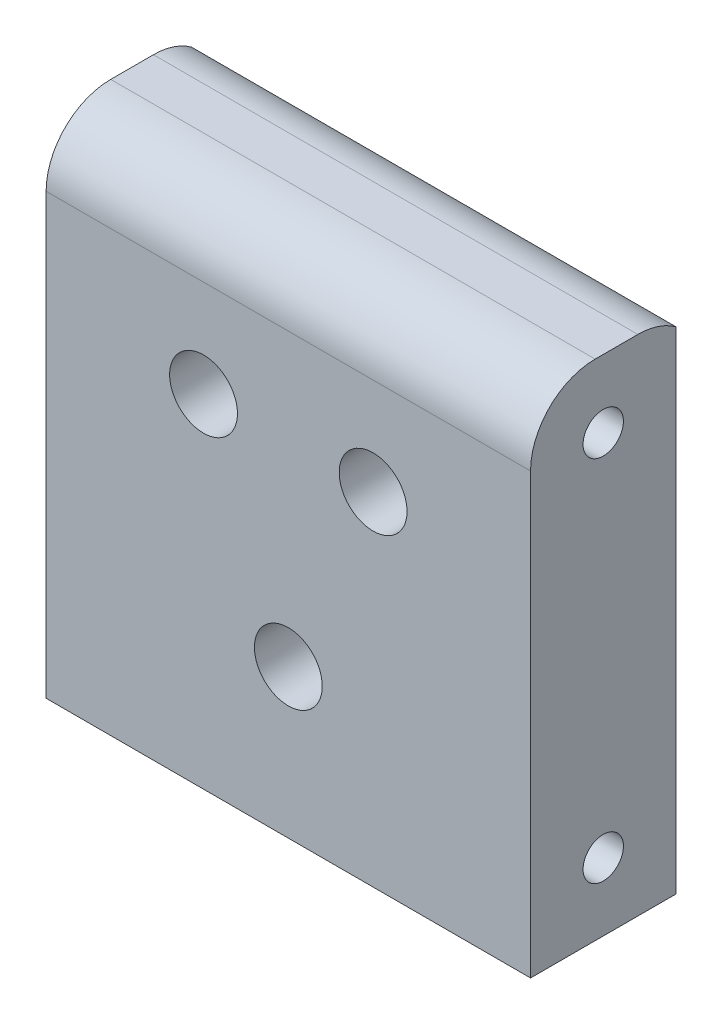
ISO-10303-21;
HEADER;
FILE_DESCRIPTION(('STEP AP214'),'2;1');
FILE_NAME('part.step','',(''),(''),'','','');
FILE_SCHEMA(('AUTOMOTIVE_DESIGN { 1 0 10303 214 1 1 1 1 }'));
ENDSEC;
DATA;
#1=APPLICATION_CONTEXT('core data for automotive mechanical design processes');
#2=APPLICATION_PROTOCOL_DEFINITION('international standard','automotive_design',2000,#1);
#3=PRODUCT_CONTEXT('',#1,'mechanical');
#4=PRODUCT('Part','Part','',(#3));
#5=PRODUCT_RELATED_PRODUCT_CATEGORY('part','',(#4));
#6=PRODUCT_DEFINITION_FORMATION('','',#4);
#7=PRODUCT_DEFINITION_CONTEXT('part definition',#1,'design');
#8=PRODUCT_DEFINITION('design','',#6,#7);
#9=PRODUCT_DEFINITION_SHAPE('','',#8);
#10=(LENGTH_UNIT() NAMED_UNIT(*) SI_UNIT(.MILLI.,.METRE.));
#11=(NAMED_UNIT(*) PLANE_ANGLE_UNIT() SI_UNIT($,.RADIAN.));
#12=(NAMED_UNIT(*) SI_UNIT($,.STERADIAN.) SOLID_ANGLE_UNIT());
#13=UNCERTAINTY_MEASURE_WITH_UNIT(LENGTH_MEASURE(1.E-05),#10,'distance_accuracy_value','');
#14=(GEOMETRIC_REPRESENTATION_CONTEXT(3) GLOBAL_UNCERTAINTY_ASSIGNED_CONTEXT((#13)) GLOBAL_UNIT_ASSIGNED_CONTEXT((#10,
#11,#12)) REPRESENTATION_CONTEXT('',''));
#15=CARTESIAN_POINT('',(0.,0.,0.));
#16=DIRECTION('',(0.,0.,1.));
#17=DIRECTION('',(1.,0.,0.));
#18=AXIS2_PLACEMENT_3D('',#15,#16,#17);
#19=CARTESIAN_POINT('',(47.4637347907293,15.5956250000031,399999.005744443));
#20=DIRECTION('',(0.,-1.,0.));
#21=DIRECTION('',(0.,0.,-1.));
#22=AXIS2_PLACEMENT_3D('',#19,#20,#21);
#23=PLANE('',#22);
#24=DIRECTION('',(0.,0.,1.));
#25=VECTOR('',#24,1.);
#26=CARTESIAN_POINT('',(15.,15.5956250000031,399999.005744443));
#27=LINE('',#26,#25);
#28=CARTESIAN_POINT('',(15.,15.595625,-2.14572709853655));
#29=VERTEX_POINT('',#28);
#30=CARTESIAN_POINT('',(15.,15.595625,0.50000000004502));
#31=VERTEX_POINT('',#30);
#32=EDGE_CURVE('E114',#29,#31,#27,.T.);
#33=ORIENTED_EDGE('',*,*,#32,.F.);
#34=DIRECTION('',(-1.,0.,0.));
#35=VECTOR('',#34,1.);
#36=CARTESIAN_POINT('',(47.4637347907293,15.595625,-2.14572709853655));
#37=LINE('',#36,#35);
#38=CARTESIAN_POINT('',(-15.,15.595625,-2.14572709853655));
#39=VERTEX_POINT('',#38);
#40=EDGE_CURVE('E37',#29,#39,#37,.T.);
#41=ORIENTED_EDGE('',*,*,#40,.T.);
#42=DIRECTION('',(0.,0.,1.));
#43=VECTOR('',#42,1.);
#44=CARTESIAN_POINT('',(-15.,15.5956250000031,399999.005744443));
#45=LINE('',#44,#43);
#46=CARTESIAN_POINT('',(-15.,15.595625,0.50000000004502));
#47=VERTEX_POINT('',#46);
#48=EDGE_CURVE('E122',#39,#47,#45,.T.);
#49=ORIENTED_EDGE('',*,*,#48,.T.);
#50=DIRECTION('',(-1.,0.,0.));
#51=VECTOR('',#50,1.);
#52=CARTESIAN_POINT('',(47.4637347907293,15.595625,0.50000000004502));
#53=LINE('',#52,#51);
#54=EDGE_CURVE('E80',#31,#47,#53,.T.);
#55=ORIENTED_EDGE('',*,*,#54,.F.);
#56=EDGE_LOOP('',(#33,#41,#49,#55));
#57=FACE_BOUND('',#56,.T.);
#58=ADVANCED_FACE('F33',(#57),#23,.F.);
#59=CARTESIAN_POINT('',(47.4637347907293,11.595625,0.5));
#60=DIRECTION('',(-1.,0.,0.));
#61=DIRECTION('',(0.,0.,1.));
#62=AXIS2_PLACEMENT_3D('',#59,#60,#61);
#63=CYLINDRICAL_SURFACE('',#62,4.);
#64=CARTESIAN_POINT('',(15.,11.595625,0.5));
#65=DIRECTION('',(1.,0.,0.));
#66=DIRECTION('',(0.,0.,-1.));
#67=AXIS2_PLACEMENT_3D('',#64,#65,#66);
#68=CIRCLE('',#67,4.);
#69=CARTESIAN_POINT('',(15.,11.595624999984,4.50000000000728));
#70=VERTEX_POINT('',#69);
#71=EDGE_CURVE('E87',#31,#70,#68,.T.);
#72=ORIENTED_EDGE('',*,*,#71,.F.);
#73=ORIENTED_EDGE('',*,*,#54,.T.);
#74=CARTESIAN_POINT('',(-15.,11.595625,0.5));
#75=DIRECTION('',(1.,0.,0.));
#76=DIRECTION('',(0.,0.,-1.));
#77=AXIS2_PLACEMENT_3D('',#74,#75,#76);
#78=CIRCLE('',#77,4.);
#79=CARTESIAN_POINT('',(-15.,11.595624999984,4.50000000000728));
#80=VERTEX_POINT('',#79);
#81=EDGE_CURVE('E121',#47,#80,#78,.T.);
#82=ORIENTED_EDGE('',*,*,#81,.T.);
#83=DIRECTION('',(-1.,0.,0.));
#84=VECTOR('',#83,1.);
#85=CARTESIAN_POINT('',(47.4637347907293,11.595624999984,4.50000000000728));
#86=LINE('',#85,#84);
#87=EDGE_CURVE('E123',#70,#80,#86,.T.);
#88=ORIENTED_EDGE('',*,*,#87,.F.);
#89=EDGE_LOOP('',(#72,#73,#82,#88));
#90=FACE_BOUND('',#89,.T.);
#91=ADVANCED_FACE('F166',(#90),#63,.T.);
#92=CARTESIAN_POINT('',(47.4637347907293,-291586.245300327,4.50000000000728));
#93=DIRECTION('',(0.,0.,-1.));
#94=DIRECTION('',(-1.,0.,0.));
#95=AXIS2_PLACEMENT_3D('',#92,#93,#94);
#96=PLANE('',#95);
#97=CARTESIAN_POINT('',(0.,-6.40437499999891,4.50000000000728));
#98=DIRECTION('',(0.,0.,1.));
#99=DIRECTION('',(1.,0.,0.));
#100=AXIS2_PLACEMENT_3D('',#97,#98,#99);
#101=CIRCLE('',#100,2.1);
#102=CARTESIAN_POINT('',(2.1,-6.40437499999891,4.50000000000728));
#103=VERTEX_POINT('',#102);
#104=EDGE_CURVE('E212',#103,#103,#101,.T.);
#105=ORIENTED_EDGE('',*,*,#104,.F.);
#106=EDGE_LOOP('',(#105));
#107=FACE_BOUND('',#106,.T.);
#108=CARTESIAN_POINT('',(-5.25,5.59562499999977,4.50000000000728));
#109=DIRECTION('',(0.,0.,1.));
#110=DIRECTION('',(1.,0.,0.));
#111=AXIS2_PLACEMENT_3D('',#108,#109,#110);
#112=CIRCLE('',#111,2.1);
#113=CARTESIAN_POINT('',(-3.15,5.59562499999977,4.50000000000728));
#114=VERTEX_POINT('',#113);
#115=EDGE_CURVE('E140',#114,#114,#112,.T.);
#116=ORIENTED_EDGE('',*,*,#115,.F.);
#117=EDGE_LOOP('',(#116));
#118=FACE_BOUND('',#117,.T.);
#119=CARTESIAN_POINT('',(5.25,5.59562499999977,4.50000000000728));
#120=DIRECTION('',(0.,0.,1.));
#121=DIRECTION('',(1.,0.,0.));
#122=AXIS2_PLACEMENT_3D('',#119,#120,#121);
#123=CIRCLE('',#122,2.1);
#124=CARTESIAN_POINT('',(7.35,5.59562499999977,4.50000000000728));
#125=VERTEX_POINT('',#124);
#126=EDGE_CURVE('E149',#125,#125,#123,.T.);
#127=ORIENTED_EDGE('',*,*,#126,.F.);
#128=EDGE_LOOP('',(#127));
#129=FACE_BOUND('',#128,.T.);
#130=DIRECTION('',(0.,-1.,0.));
#131=VECTOR('',#130,1.);
#132=CARTESIAN_POINT('',(15.,-291586.245300327,4.50000000000728));
#133=LINE('',#132,#131);
#134=CARTESIAN_POINT('',(15.,-15.5956250000031,4.50000000000728));
#135=VERTEX_POINT('',#134);
#136=EDGE_CURVE('E108',#70,#135,#133,.T.);
#137=ORIENTED_EDGE('',*,*,#136,.F.);
#138=ORIENTED_EDGE('',*,*,#87,.T.);
#139=DIRECTION('',(0.,-1.,0.));
#140=VECTOR('',#139,1.);
#141=CARTESIAN_POINT('',(-15.,-291586.245300327,4.50000000000728));
#142=LINE('',#141,#140);
#143=CARTESIAN_POINT('',(-15.,-15.5956250000031,4.50000000000728));
#144=VERTEX_POINT('',#143);
#145=EDGE_CURVE('E125',#80,#144,#142,.T.);
#146=ORIENTED_EDGE('',*,*,#145,.T.);
#147=DIRECTION('',(-1.,0.,0.));
#148=VECTOR('',#147,1.);
#149=CARTESIAN_POINT('',(47.4637347907293,-15.5956250000031,4.50000000000728));
#150=LINE('',#149,#148);
#151=EDGE_CURVE('E126',#135,#144,#150,.T.);
#152=ORIENTED_EDGE('',*,*,#151,.F.);
#153=EDGE_LOOP('',(#137,#138,#146,#152));
#154=FACE_BOUND('',#153,.T.);
#155=ADVANCED_FACE('F163',(#107,#118,#129,#154),#96,.F.);
#156=CARTESIAN_POINT('',(47.4637347907293,-15.5956250000031,399999.005744443));
#157=DIRECTION('',(0.,1.,0.));
#158=DIRECTION('',(0.,0.,1.));
#159=AXIS2_PLACEMENT_3D('',#156,#157,#158);
#160=PLANE('',#159);
#161=DIRECTION('',(0.,0.,-1.));
#162=VECTOR('',#161,1.);
#163=CARTESIAN_POINT('',(15.,-15.5956250000031,399999.005744443));
#164=LINE('',#163,#162);
#165=CARTESIAN_POINT('',(15.,-15.5956250000031,-4.49999999999896));
#166=VERTEX_POINT('',#165);
#167=EDGE_CURVE('E42',#135,#166,#164,.T.);
#168=ORIENTED_EDGE('',*,*,#167,.F.);
#169=ORIENTED_EDGE('',*,*,#151,.T.);
#170=DIRECTION('',(0.,0.,-1.));
#171=VECTOR('',#170,1.);
#172=CARTESIAN_POINT('',(-15.,-15.5956250000031,399999.005744443));
#173=LINE('',#172,#171);
#174=CARTESIAN_POINT('',(-15.,-15.5956250000031,-4.49999999999896));
#175=VERTEX_POINT('',#174);
#176=EDGE_CURVE('E103',#144,#175,#173,.T.);
#177=ORIENTED_EDGE('',*,*,#176,.T.);
#178=DIRECTION('',(-1.,0.,0.));
#179=VECTOR('',#178,1.);
#180=CARTESIAN_POINT('',(47.4637347907293,-15.5956250000031,-4.49999999999896));
#181=LINE('',#180,#179);
#182=EDGE_CURVE('E94',#166,#175,#181,.T.);
#183=ORIENTED_EDGE('',*,*,#182,.F.);
#184=EDGE_LOOP('',(#168,#169,#177,#183));
#185=FACE_BOUND('',#184,.T.);
#186=ADVANCED_FACE('F100',(#185),#160,.F.);
#187=CARTESIAN_POINT('',(47.4637347907293,-291586.245300327,-4.50000000000728));
#188=DIRECTION('',(0.,0.,1.));
#189=DIRECTION('',(0.,-1.,0.));
#190=AXIS2_PLACEMENT_3D('',#187,#188,#189);
#191=PLANE('',#190);
#192=CARTESIAN_POINT('',(0.,-6.40437499999891,-4.49999999999896));
#193=DIRECTION('',(0.,0.,1.));
#194=DIRECTION('',(1.,0.,0.));
#195=AXIS2_PLACEMENT_3D('',#192,#193,#194);
#196=CIRCLE('',#195,2.1);
#197=CARTESIAN_POINT('',(2.1,-6.40437499999891,-4.49999999999896));
#198=VERTEX_POINT('',#197);
#199=EDGE_CURVE('E151',#198,#198,#196,.T.);
#200=ORIENTED_EDGE('',*,*,#199,.T.);
#201=EDGE_LOOP('',(#200));
#202=FACE_BOUND('',#201,.T.);
#203=CARTESIAN_POINT('',(-5.25,5.59562499999977,-4.49999999999896));
#204=DIRECTION('',(0.,0.,1.));
#205=DIRECTION('',(1.,0.,0.));
#206=AXIS2_PLACEMENT_3D('',#203,#204,#205);
#207=CIRCLE('',#206,2.1);
#208=CARTESIAN_POINT('',(-3.15,5.59562499999977,-4.49999999999896));
#209=VERTEX_POINT('',#208);
#210=EDGE_CURVE('E138',#209,#209,#207,.T.);
#211=ORIENTED_EDGE('',*,*,#210,.T.);
#212=EDGE_LOOP('',(#211));
#213=FACE_BOUND('',#212,.T.);
#214=CARTESIAN_POINT('',(5.25,5.59562499999977,-4.49999999999896));
#215=DIRECTION('',(0.,0.,1.));
#216=DIRECTION('',(1.,0.,0.));
#217=AXIS2_PLACEMENT_3D('',#214,#215,#216);
#218=CIRCLE('',#217,2.1);
#219=CARTESIAN_POINT('',(7.35,5.59562499999977,-4.49999999999896));
#220=VERTEX_POINT('',#219);
#221=EDGE_CURVE('E145',#220,#220,#218,.T.);
#222=ORIENTED_EDGE('',*,*,#221,.T.);
#223=EDGE_LOOP('',(#222));
#224=FACE_BOUND('',#223,.T.);
#225=DIRECTION('',(0.,1.,0.));
#226=VECTOR('',#225,1.);
#227=CARTESIAN_POINT('',(15.,-291586.245300327,-4.50000000000728));
#228=LINE('',#227,#226);
#229=CARTESIAN_POINT('',(15.,14.8294152074016,-4.49999999997833));
#230=VERTEX_POINT('',#229);
#231=EDGE_CURVE('E11',#166,#230,#228,.T.);
#232=ORIENTED_EDGE('',*,*,#231,.F.);
#233=ORIENTED_EDGE('',*,*,#182,.T.);
#234=DIRECTION('',(0.,1.,0.));
#235=VECTOR('',#234,1.);
#236=CARTESIAN_POINT('',(-15.,-291586.245300327,-4.50000000000728));
#237=LINE('',#236,#235);
#238=CARTESIAN_POINT('',(-15.,14.8294152074016,-4.49999999997833));
#239=VERTEX_POINT('',#238);
#240=EDGE_CURVE('E105',#175,#239,#237,.T.);
#241=ORIENTED_EDGE('',*,*,#240,.T.);
#242=DIRECTION('',(-1.,0.,0.));
#243=VECTOR('',#242,1.);
#244=CARTESIAN_POINT('',(47.4637347907293,14.8294152074016,-4.49999999997833));
#245=LINE('',#244,#243);
#246=EDGE_CURVE('E55',#230,#239,#245,.T.);
#247=ORIENTED_EDGE('',*,*,#246,.F.);
#248=EDGE_LOOP('',(#232,#233,#241,#247));
#249=FACE_BOUND('',#248,.T.);
#250=ADVANCED_FACE('F93',(#202,#213,#224,#249),#191,.F.);
#251=CARTESIAN_POINT('',(47.4637347907293,11.595625,-2.14572709852589));
#252=DIRECTION('',(-1.,0.,0.));
#253=DIRECTION('',(0.,0.,1.));
#254=AXIS2_PLACEMENT_3D('',#251,#252,#253);
#255=CYLINDRICAL_SURFACE('',#254,4.);
#256=CARTESIAN_POINT('',(15.,11.595625,-2.14572709852589));
#257=DIRECTION('',(1.,0.,0.));
#258=DIRECTION('',(0.,0.,-1.));
#259=AXIS2_PLACEMENT_3D('',#256,#257,#258);
#260=CIRCLE('',#259,4.);
#261=EDGE_CURVE('E117',#230,#29,#260,.T.);
#262=ORIENTED_EDGE('',*,*,#261,.F.);
#263=ORIENTED_EDGE('',*,*,#246,.T.);
#264=CARTESIAN_POINT('',(-15.,11.595625,-2.14572709852589));
#265=DIRECTION('',(1.,0.,0.));
#266=DIRECTION('',(0.,0.,-1.));
#267=AXIS2_PLACEMENT_3D('',#264,#265,#266);
#268=CIRCLE('',#267,4.);
#269=EDGE_CURVE('E119',#239,#39,#268,.T.);
#270=ORIENTED_EDGE('',*,*,#269,.T.);
#271=ORIENTED_EDGE('',*,*,#40,.F.);
#272=EDGE_LOOP('',(#262,#263,#270,#271));
#273=FACE_BOUND('',#272,.T.);
#274=ADVANCED_FACE('F180',(#273),#255,.T.);
#275=CARTESIAN_POINT('',(-15.,11.595625,0.5));
#276=DIRECTION('',(1.,0.,0.));
#277=DIRECTION('',(0.,0.,-1.));
#278=AXIS2_PLACEMENT_3D('',#275,#276,#277);
#279=PLANE('',#278);
#280=CARTESIAN_POINT('',(-15.,11.3956249999987,0.));
#281=DIRECTION('',(1.,0.,0.));
#282=DIRECTION('',(0.,0.,-1.));
#283=AXIS2_PLACEMENT_3D('',#280,#281,#282);
#284=CIRCLE('',#283,1.25);
#285=CARTESIAN_POINT('',(-15.,11.3956249999987,-1.25));
#286=VERTEX_POINT('',#285);
#287=EDGE_CURVE('E207',#286,#286,#284,.T.);
#288=ORIENTED_EDGE('',*,*,#287,.T.);
#289=EDGE_LOOP('',(#288));
#290=FACE_BOUND('',#289,.T.);
#291=CARTESIAN_POINT('',(-15.,-11.3956249999987,0.));
#292=DIRECTION('',(1.,0.,0.));
#293=DIRECTION('',(0.,0.,-1.));
#294=AXIS2_PLACEMENT_3D('',#291,#292,#293);
#295=CIRCLE('',#294,1.25);
#296=CARTESIAN_POINT('',(-15.,-11.3956249999987,-1.25));
#297=VERTEX_POINT('',#296);
#298=EDGE_CURVE('E219',#297,#297,#295,.T.);
#299=ORIENTED_EDGE('',*,*,#298,.T.);
#300=EDGE_LOOP('',(#299));
#301=FACE_BOUND('',#300,.T.);
#302=ORIENTED_EDGE('',*,*,#48,.F.);
#303=ORIENTED_EDGE('',*,*,#269,.F.);
#304=ORIENTED_EDGE('',*,*,#240,.F.);
#305=ORIENTED_EDGE('',*,*,#176,.F.);
#306=ORIENTED_EDGE('',*,*,#145,.F.);
#307=ORIENTED_EDGE('',*,*,#81,.F.);
#308=EDGE_LOOP('',(#302,#303,#304,#305,#306,#307));
#309=FACE_BOUND('',#308,.T.);
#310=ADVANCED_FACE('F184',(#290,#301,#309),#279,.F.);
#311=CARTESIAN_POINT('',(15.,0.,0.));
#312=DIRECTION('',(1.,0.,0.));
#313=DIRECTION('',(0.,0.,-1.));
#314=AXIS2_PLACEMENT_3D('',#311,#312,#313);
#315=PLANE('',#314);
#316=CARTESIAN_POINT('',(15.,11.3956249999987,0.));
#317=DIRECTION('',(1.,0.,0.));
#318=DIRECTION('',(0.,0.,-1.));
#319=AXIS2_PLACEMENT_3D('',#316,#317,#318);
#320=CIRCLE('',#319,1.25);
#321=CARTESIAN_POINT('',(15.,11.3956249999987,-1.25));
#322=VERTEX_POINT('',#321);
#323=EDGE_CURVE('E210',#322,#322,#320,.T.);
#324=ORIENTED_EDGE('',*,*,#323,.F.);
#325=EDGE_LOOP('',(#324));
#326=FACE_BOUND('',#325,.T.);
#327=CARTESIAN_POINT('',(15.,-11.3956249999987,0.));
#328=DIRECTION('',(1.,0.,0.));
#329=DIRECTION('',(0.,0.,-1.));
#330=AXIS2_PLACEMENT_3D('',#327,#328,#329);
#331=CIRCLE('',#330,1.25);
#332=CARTESIAN_POINT('',(15.,-11.3956249999987,-1.25));
#333=VERTEX_POINT('',#332);
#334=EDGE_CURVE('E216',#333,#333,#331,.T.);
#335=ORIENTED_EDGE('',*,*,#334,.F.);
#336=EDGE_LOOP('',(#335));
#337=FACE_BOUND('',#336,.T.);
#338=ORIENTED_EDGE('',*,*,#261,.T.);
#339=ORIENTED_EDGE('',*,*,#32,.T.);
#340=ORIENTED_EDGE('',*,*,#71,.T.);
#341=ORIENTED_EDGE('',*,*,#136,.T.);
#342=ORIENTED_EDGE('',*,*,#167,.T.);
#343=ORIENTED_EDGE('',*,*,#231,.T.);
#344=EDGE_LOOP('',(#338,#339,#340,#341,#342,#343));
#345=FACE_BOUND('',#344,.T.);
#346=ADVANCED_FACE('F35',(#326,#337,#345),#315,.T.);
#347=CARTESIAN_POINT('',(5.25,5.59562499999977,-4.49999999999896));
#348=DIRECTION('',(0.,0.,1.));
#349=DIRECTION('',(1.,0.,0.));
#350=AXIS2_PLACEMENT_3D('',#347,#348,#349);
#351=CYLINDRICAL_SURFACE('',#350,2.1);
#352=ORIENTED_EDGE('',*,*,#221,.F.);
#353=EDGE_LOOP('',(#352));
#354=FACE_BOUND('',#353,.T.);
#355=ORIENTED_EDGE('',*,*,#126,.T.);
#356=EDGE_LOOP('',(#355));
#357=FACE_BOUND('',#356,.T.);
#358=ADVANCED_FACE('F156',(#354,#357),#351,.F.);
#359=CARTESIAN_POINT('',(-5.25,5.59562499999977,-4.49999999999896));
#360=DIRECTION('',(0.,0.,1.));
#361=DIRECTION('',(1.,0.,0.));
#362=AXIS2_PLACEMENT_3D('',#359,#360,#361);
#363=CYLINDRICAL_SURFACE('',#362,2.1);
#364=ORIENTED_EDGE('',*,*,#210,.F.);
#365=EDGE_LOOP('',(#364));
#366=FACE_BOUND('',#365,.T.);
#367=ORIENTED_EDGE('',*,*,#115,.T.);
#368=EDGE_LOOP('',(#367));
#369=FACE_BOUND('',#368,.T.);
#370=ADVANCED_FACE('F159',(#366,#369),#363,.F.);
#371=CARTESIAN_POINT('',(0.,-6.40437499999891,-4.49999999999896));
#372=DIRECTION('',(0.,0.,1.));
#373=DIRECTION('',(1.,0.,0.));
#374=AXIS2_PLACEMENT_3D('',#371,#372,#373);
#375=CYLINDRICAL_SURFACE('',#374,2.1);
#376=ORIENTED_EDGE('',*,*,#199,.F.);
#377=EDGE_LOOP('',(#376));
#378=FACE_BOUND('',#377,.T.);
#379=ORIENTED_EDGE('',*,*,#104,.T.);
#380=EDGE_LOOP('',(#379));
#381=FACE_BOUND('',#380,.T.);
#382=ADVANCED_FACE('F190',(#378,#381),#375,.F.);
#383=CARTESIAN_POINT('',(-15.,-11.3956249999987,0.));
#384=DIRECTION('',(1.,0.,0.));
#385=DIRECTION('',(0.,0.,-1.));
#386=AXIS2_PLACEMENT_3D('',#383,#384,#385);
#387=CYLINDRICAL_SURFACE('',#386,1.25);
#388=ORIENTED_EDGE('',*,*,#298,.F.);
#389=EDGE_LOOP('',(#388));
#390=FACE_BOUND('',#389,.T.);
#391=ORIENTED_EDGE('',*,*,#334,.T.);
#392=EDGE_LOOP('',(#391));
#393=FACE_BOUND('',#392,.T.);
#394=ADVANCED_FACE('F194',(#390,#393),#387,.F.);
#395=CARTESIAN_POINT('',(-15.,11.3956249999987,0.));
#396=DIRECTION('',(1.,0.,0.));
#397=DIRECTION('',(0.,0.,-1.));
#398=AXIS2_PLACEMENT_3D('',#395,#396,#397);
#399=CYLINDRICAL_SURFACE('',#398,1.25);
#400=ORIENTED_EDGE('',*,*,#287,.F.);
#401=EDGE_LOOP('',(#400));
#402=FACE_BOUND('',#401,.T.);
#403=ORIENTED_EDGE('',*,*,#323,.T.);
#404=EDGE_LOOP('',(#403));
#405=FACE_BOUND('',#404,.T.);
#406=ADVANCED_FACE('F198',(#402,#405),#399,.F.);
#407=CLOSED_SHELL('',(#58,#91,#155,#186,#250,#274,#310,#346,#358,#370,#382,#394,#406));
#408=MANIFOLD_SOLID_BREP('B2',#407);
#409=ADVANCED_BREP_SHAPE_REPRESENTATION('',(#18,#408),#14);
#410=SHAPE_DEFINITION_REPRESENTATION(#9,#409);
ENDSEC;
END-ISO-10303-21;
